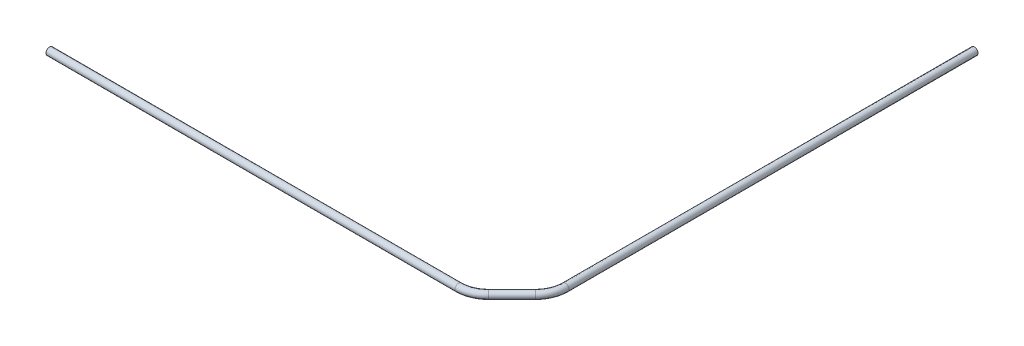
ISO-10303-21;
HEADER;
FILE_DESCRIPTION(('STEP AP214'),'2;1');
FILE_NAME('part.step','',(''),(''),'','','');
FILE_SCHEMA(('AUTOMOTIVE_DESIGN { 1 0 10303 214 1 1 1 1 }'));
ENDSEC;
DATA;
#1=APPLICATION_CONTEXT('core data for automotive mechanical design processes');
#2=APPLICATION_PROTOCOL_DEFINITION('international standard','automotive_design',2000,#1);
#3=PRODUCT_CONTEXT('',#1,'mechanical');
#4=PRODUCT('Part','Part','',(#3));
#5=PRODUCT_RELATED_PRODUCT_CATEGORY('part','',(#4));
#6=PRODUCT_DEFINITION_FORMATION('','',#4);
#7=PRODUCT_DEFINITION_CONTEXT('part definition',#1,'design');
#8=PRODUCT_DEFINITION('design','',#6,#7);
#9=PRODUCT_DEFINITION_SHAPE('','',#8);
#10=(LENGTH_UNIT() NAMED_UNIT(*) SI_UNIT(.MILLI.,.METRE.));
#11=(NAMED_UNIT(*) PLANE_ANGLE_UNIT() SI_UNIT($,.RADIAN.));
#12=(NAMED_UNIT(*) SI_UNIT($,.STERADIAN.) SOLID_ANGLE_UNIT());
#13=UNCERTAINTY_MEASURE_WITH_UNIT(LENGTH_MEASURE(1.E-05),#10,'distance_accuracy_value','');
#14=(GEOMETRIC_REPRESENTATION_CONTEXT(3) GLOBAL_UNCERTAINTY_ASSIGNED_CONTEXT((#13)) GLOBAL_UNIT_ASSIGNED_CONTEXT((#10,
#11,#12)) REPRESENTATION_CONTEXT('',''));
#15=CARTESIAN_POINT('',(0.,0.,0.));
#16=DIRECTION('',(0.,0.,1.));
#17=DIRECTION('',(1.,0.,0.));
#18=AXIS2_PLACEMENT_3D('',#15,#16,#17);
#19=CARTESIAN_POINT('',(17.9999999999998,0.,-750.));
#20=DIRECTION('',(0.,0.,1.));
#21=DIRECTION('',(1.,0.,0.));
#22=AXIS2_PLACEMENT_3D('',#19,#20,#21);
#23=PLANE('',#22);
#24=CARTESIAN_POINT('',(17.9999999999998,0.,-750.));
#25=DIRECTION('',(0.,0.,1.));
#26=DIRECTION('',(1.,0.,0.));
#27=AXIS2_PLACEMENT_3D('',#24,#25,#26);
#28=CIRCLE('',#27,6.);
#29=CARTESIAN_POINT('',(23.9999999999998,0.,-750.));
#30=VERTEX_POINT('',#29);
#31=EDGE_CURVE('E61',#30,#30,#28,.T.);
#32=ORIENTED_EDGE('',*,*,#31,.F.);
#33=EDGE_LOOP('',(#32));
#34=FACE_BOUND('',#33,.T.);
#35=ADVANCED_FACE('F32',(#34),#23,.F.);
#36=CARTESIAN_POINT('',(-750.000000000002,-3.10862446895044E-12,17.9999999999971));
#37=DIRECTION('',(-1.,0.,0.));
#38=DIRECTION('',(0.,0.,1.));
#39=AXIS2_PLACEMENT_3D('',#36,#37,#38);
#40=PLANE('',#39);
#41=CARTESIAN_POINT('',(-750.000000000002,-3.10862446895044E-12,17.9999999999971));
#42=DIRECTION('',(-1.,0.,0.));
#43=DIRECTION('',(0.,0.,1.));
#44=AXIS2_PLACEMENT_3D('',#41,#42,#43);
#45=CIRCLE('',#44,6.);
#46=CARTESIAN_POINT('',(-750.000000000002,-3.11328740565386E-12,23.9999999999971));
#47=VERTEX_POINT('',#46);
#48=EDGE_CURVE('E10',#47,#47,#45,.T.);
#49=ORIENTED_EDGE('',*,*,#48,.T.);
#50=EDGE_LOOP('',(#49));
#51=FACE_BOUND('',#50,.T.);
#52=ADVANCED_FACE('F70',(#51),#40,.T.);
#53=CARTESIAN_POINT('',(17.9999999999998,0.,-750.));
#54=DIRECTION('',(0.,0.,1.));
#55=DIRECTION('',(1.,0.,0.));
#56=AXIS2_PLACEMENT_3D('',#53,#54,#55);
#57=CYLINDRICAL_SURFACE('',#56,6.);
#58=CARTESIAN_POINT('',(17.999999999998,0.,-70.7106781186564));
#59=DIRECTION('',(0.,0.,1.));
#60=DIRECTION('',(1.,0.,0.));
#61=AXIS2_PLACEMENT_3D('',#58,#59,#60);
#62=CIRCLE('',#61,6.);
#63=CARTESIAN_POINT('',(23.999999999999,0.,-70.7106781186565));
#64=VERTEX_POINT('',#63);
#65=EDGE_CURVE('E57',#64,#64,#62,.T.);
#66=ORIENTED_EDGE('',*,*,#65,.F.);
#67=EDGE_LOOP('',(#66));
#68=FACE_BOUND('',#67,.T.);
#69=ORIENTED_EDGE('',*,*,#31,.T.);
#70=EDGE_LOOP('',(#69));
#71=FACE_BOUND('',#70,.T.);
#72=ADVANCED_FACE('F67',(#68,#71),#57,.T.);
#73=CARTESIAN_POINT('',(-32.0000000000009,0.,-70.7106781186555));
#74=DIRECTION('',(0.,-1.,0.));
#75=DIRECTION('',(0.,0.,-1.));
#76=AXIS2_PLACEMENT_3D('',#73,#74,#75);
#77=TOROIDAL_SURFACE('',#76,49.9999999999999,6.);
#78=CARTESIAN_POINT('',(3.35533905932461,0.,-35.3553390593273));
#79=DIRECTION('',(-0.707106781186573,0.,0.707106781186522));
#80=DIRECTION('',(0.707106781186522,0.,0.707106781186573));
#81=AXIS2_PLACEMENT_3D('',#78,#79,#80);
#82=CIRCLE('',#81,6.);
#83=CARTESIAN_POINT('',(7.59797974644419,0.,-31.1126983722074));
#84=VERTEX_POINT('',#83);
#85=EDGE_CURVE('E51',#84,#84,#82,.T.);
#86=CARTESIAN_POINT('',(-32.0000000000009,0.,-70.7106781186555));
#87=DIRECTION('',(0.,-1.,0.));
#88=DIRECTION('',(0.,0.,-1.));
#89=AXIS2_PLACEMENT_3D('',#86,#87,#88);
#90=CIRCLE('',#89,55.9999999999999);
#91=EDGE_CURVE('',#64,#84,#90,.T.);
#92=ORIENTED_EDGE('',*,*,#65,.T.);
#93=ORIENTED_EDGE('',*,*,#85,.F.);
#94=ORIENTED_EDGE('',*,*,#91,.T.);
#95=ORIENTED_EDGE('',*,*,#91,.F.);
#96=EDGE_LOOP('',(#92,#94,#93,#95));
#97=FACE_BOUND('',#96,.T.);
#98=ADVANCED_FACE('F88',(#97),#77,.T.);
#99=CARTESIAN_POINT('',(3.35533905932461,0.,-35.3553390593273));
#100=DIRECTION('',(-0.707106781186602,0.,0.707106781186493));
#101=DIRECTION('',(0.707106781186493,0.,0.707106781186602));
#102=AXIS2_PLACEMENT_3D('',#99,#100,#101);
#103=CYLINDRICAL_SURFACE('',#102,6.);
#104=CARTESIAN_POINT('',(-35.3553390593353,0.,3.35533905932728));
#105=DIRECTION('',(-0.707106781186602,0.,0.707106781186493));
#106=DIRECTION('',(0.707106781186493,0.,0.707106781186602));
#107=AXIS2_PLACEMENT_3D('',#104,#105,#106);
#108=CIRCLE('',#107,6.);
#109=CARTESIAN_POINT('',(-31.1126983722163,3.73034936274055E-13,7.59797974644689));
#110=VERTEX_POINT('',#109);
#111=EDGE_CURVE('E45',#110,#110,#108,.T.);
#112=ORIENTED_EDGE('',*,*,#111,.F.);
#113=EDGE_LOOP('',(#112));
#114=FACE_BOUND('',#113,.T.);
#115=ORIENTED_EDGE('',*,*,#85,.T.);
#116=EDGE_LOOP('',(#115));
#117=FACE_BOUND('',#116,.T.);
#118=ADVANCED_FACE('F82',(#114,#117),#103,.T.);
#119=CARTESIAN_POINT('',(-70.7106781186599,-3.10862446895044E-12,-32.0000000000027));
#120=DIRECTION('',(0.,-1.,0.));
#121=DIRECTION('',(0.,0.,-1.));
#122=AXIS2_PLACEMENT_3D('',#119,#120,#121);
#123=TOROIDAL_SURFACE('',#122,49.9999999999999,6.);
#124=CARTESIAN_POINT('',(-70.710678118659,-3.10862446895044E-12,17.9999999999971));
#125=DIRECTION('',(-1.,0.,0.));
#126=DIRECTION('',(0.,0.,1.));
#127=AXIS2_PLACEMENT_3D('',#124,#125,#126);
#128=CIRCLE('',#127,6.);
#129=CARTESIAN_POINT('',(-70.7106781186589,-3.10862446895044E-12,23.9999999999972));
#130=VERTEX_POINT('',#129);
#131=EDGE_CURVE('E39',#130,#130,#128,.T.);
#132=CARTESIAN_POINT('',(-70.7106781186599,-3.10862446895044E-12,-32.0000000000027));
#133=DIRECTION('',(0.,-1.,0.));
#134=DIRECTION('',(0.,0.,-1.));
#135=AXIS2_PLACEMENT_3D('',#132,#133,#134);
#136=CIRCLE('',#135,55.9999999999999);
#137=EDGE_CURVE('',#110,#130,#136,.T.);
#138=ORIENTED_EDGE('',*,*,#111,.T.);
#139=ORIENTED_EDGE('',*,*,#131,.F.);
#140=ORIENTED_EDGE('',*,*,#137,.T.);
#141=ORIENTED_EDGE('',*,*,#137,.F.);
#142=EDGE_LOOP('',(#138,#140,#139,#141));
#143=FACE_BOUND('',#142,.T.);
#144=ADVANCED_FACE('F76',(#143),#123,.T.);
#145=CARTESIAN_POINT('',(-70.710678118659,-3.10862446895044E-12,17.9999999999971));
#146=DIRECTION('',(-1.,0.,0.));
#147=DIRECTION('',(0.,0.,1.));
#148=AXIS2_PLACEMENT_3D('',#145,#146,#147);
#149=CYLINDRICAL_SURFACE('',#148,6.);
#150=ORIENTED_EDGE('',*,*,#48,.F.);
#151=EDGE_LOOP('',(#150));
#152=FACE_BOUND('',#151,.T.);
#153=ORIENTED_EDGE('',*,*,#131,.T.);
#154=EDGE_LOOP('',(#153));
#155=FACE_BOUND('',#154,.T.);
#156=ADVANCED_FACE('F74',(#152,#155),#149,.T.);
#157=CLOSED_SHELL('',(#35,#52,#72,#98,#118,#144,#156));
#158=MANIFOLD_SOLID_BREP('B2',#157);
#159=ADVANCED_BREP_SHAPE_REPRESENTATION('',(#18,#158),#14);
#160=SHAPE_DEFINITION_REPRESENTATION(#9,#159);
ENDSEC;
END-ISO-10303-21;
